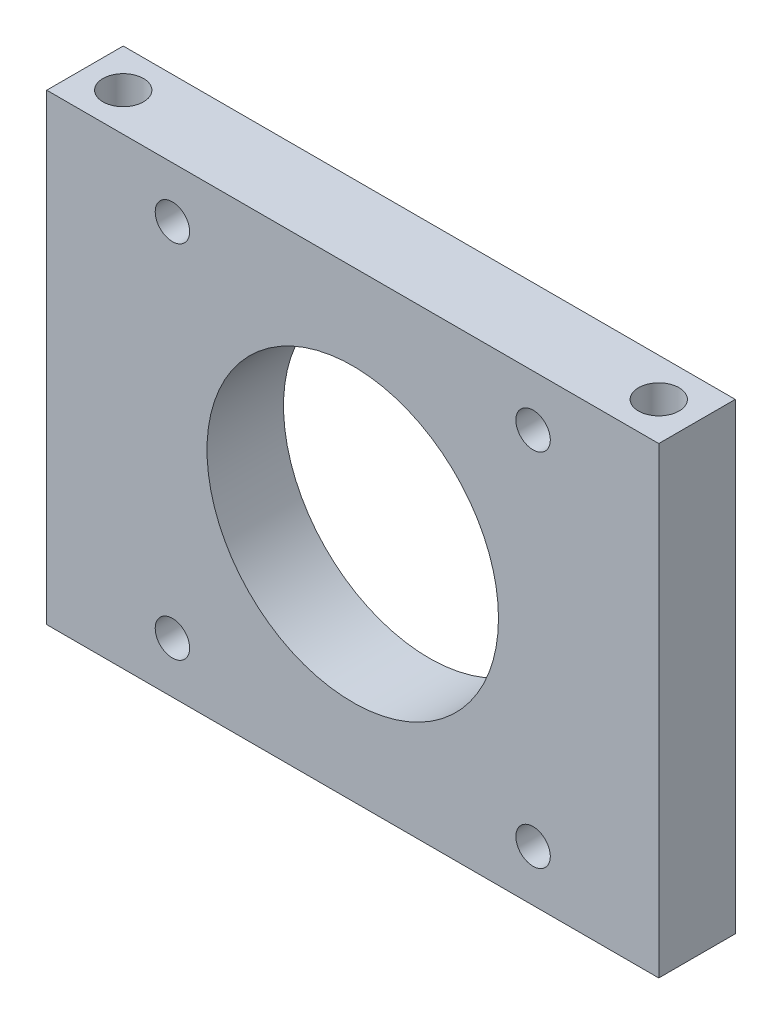
ISO-10303-21;
HEADER;
FILE_DESCRIPTION(('STEP AP214'),'2;1');
FILE_NAME('part.step','',(''),(''),'','','');
FILE_SCHEMA(('AUTOMOTIVE_DESIGN { 1 0 10303 214 1 1 1 1 }'));
ENDSEC;
DATA;
#1=APPLICATION_CONTEXT('core data for automotive mechanical design processes');
#2=APPLICATION_PROTOCOL_DEFINITION('international standard','automotive_design',2000,#1);
#3=PRODUCT_CONTEXT('',#1,'mechanical');
#4=PRODUCT('Part','Part','',(#3));
#5=PRODUCT_RELATED_PRODUCT_CATEGORY('part','',(#4));
#6=PRODUCT_DEFINITION_FORMATION('','',#4);
#7=PRODUCT_DEFINITION_CONTEXT('part definition',#1,'design');
#8=PRODUCT_DEFINITION('design','',#6,#7);
#9=PRODUCT_DEFINITION_SHAPE('','',#8);
#10=(LENGTH_UNIT() NAMED_UNIT(*) SI_UNIT(.MILLI.,.METRE.));
#11=(NAMED_UNIT(*) PLANE_ANGLE_UNIT() SI_UNIT($,.RADIAN.));
#12=(NAMED_UNIT(*) SI_UNIT($,.STERADIAN.) SOLID_ANGLE_UNIT());
#13=UNCERTAINTY_MEASURE_WITH_UNIT(LENGTH_MEASURE(1.E-05),#10,'distance_accuracy_value','');
#14=(GEOMETRIC_REPRESENTATION_CONTEXT(3) GLOBAL_UNCERTAINTY_ASSIGNED_CONTEXT((#13)) GLOBAL_UNIT_ASSIGNED_CONTEXT((#10,
#11,#12)) REPRESENTATION_CONTEXT('',''));
#15=CARTESIAN_POINT('',(0.,0.,0.));
#16=DIRECTION('',(0.,0.,1.));
#17=DIRECTION('',(1.,0.,0.));
#18=AXIS2_PLACEMENT_3D('',#15,#16,#17);
#19=CARTESIAN_POINT('',(40.,-30.25,5.));
#20=DIRECTION('',(-1.,0.,0.));
#21=DIRECTION('',(0.,0.,1.));
#22=AXIS2_PLACEMENT_3D('',#19,#20,#21);
#23=PLANE('',#22);
#24=DIRECTION('',(0.,1.,0.));
#25=VECTOR('',#24,1.);
#26=CARTESIAN_POINT('',(40.,-30.25,-5.));
#27=LINE('',#26,#25);
#28=CARTESIAN_POINT('',(40.,-30.25,-5.));
#29=VERTEX_POINT('',#28);
#30=CARTESIAN_POINT('',(40.,30.25,-5.));
#31=VERTEX_POINT('',#30);
#32=EDGE_CURVE('E96',#29,#31,#27,.T.);
#33=ORIENTED_EDGE('',*,*,#32,.T.);
#34=DIRECTION('',(0.,0.,-1.));
#35=VECTOR('',#34,1.);
#36=CARTESIAN_POINT('',(40.,30.25,5.));
#37=LINE('',#36,#35);
#38=CARTESIAN_POINT('',(40.,30.25,5.));
#39=VERTEX_POINT('',#38);
#40=EDGE_CURVE('E11',#39,#31,#37,.T.);
#41=ORIENTED_EDGE('',*,*,#40,.F.);
#42=DIRECTION('',(0.,1.,0.));
#43=VECTOR('',#42,1.);
#44=CARTESIAN_POINT('',(40.,-30.25,5.));
#45=LINE('',#44,#43);
#46=CARTESIAN_POINT('',(40.,-30.25,5.));
#47=VERTEX_POINT('',#46);
#48=EDGE_CURVE('E84',#47,#39,#45,.T.);
#49=ORIENTED_EDGE('',*,*,#48,.F.);
#50=DIRECTION('',(0.,0.,-1.));
#51=VECTOR('',#50,1.);
#52=CARTESIAN_POINT('',(40.,-30.25,5.));
#53=LINE('',#52,#51);
#54=EDGE_CURVE('E92',#47,#29,#53,.T.);
#55=ORIENTED_EDGE('',*,*,#54,.T.);
#56=EDGE_LOOP('',(#33,#41,#49,#55));
#57=FACE_BOUND('',#56,.T.);
#58=ADVANCED_FACE('F33',(#57),#23,.F.);
#59=CARTESIAN_POINT('',(-40.,30.25,5.));
#60=DIRECTION('',(0.,-1.,0.));
#61=DIRECTION('',(0.,0.,-1.));
#62=AXIS2_PLACEMENT_3D('',#59,#60,#61);
#63=PLANE('',#62);
#64=CARTESIAN_POINT('',(-35.,30.25,0.));
#65=DIRECTION('',(0.,1.,0.));
#66=DIRECTION('',(0.,0.,1.));
#67=AXIS2_PLACEMENT_3D('',#64,#65,#66);
#68=CIRCLE('',#67,2.65);
#69=CARTESIAN_POINT('',(-35.,30.25,2.65));
#70=VERTEX_POINT('',#69);
#71=EDGE_CURVE('E148',#70,#70,#68,.T.);
#72=ORIENTED_EDGE('',*,*,#71,.F.);
#73=EDGE_LOOP('',(#72));
#74=FACE_BOUND('',#73,.T.);
#75=CARTESIAN_POINT('',(35.,30.25,0.));
#76=DIRECTION('',(0.,1.,0.));
#77=DIRECTION('',(0.,0.,1.));
#78=AXIS2_PLACEMENT_3D('',#75,#76,#77);
#79=CIRCLE('',#78,2.65);
#80=CARTESIAN_POINT('',(35.,30.25,2.65));
#81=VERTEX_POINT('',#80);
#82=EDGE_CURVE('E142',#81,#81,#79,.T.);
#83=ORIENTED_EDGE('',*,*,#82,.F.);
#84=EDGE_LOOP('',(#83));
#85=FACE_BOUND('',#84,.T.);
#86=DIRECTION('',(-1.,0.,0.));
#87=VECTOR('',#86,1.);
#88=CARTESIAN_POINT('',(-40.,30.25,-5.));
#89=LINE('',#88,#87);
#90=CARTESIAN_POINT('',(-40.,30.25,-5.));
#91=VERTEX_POINT('',#90);
#92=EDGE_CURVE('E88',#31,#91,#89,.T.);
#93=ORIENTED_EDGE('',*,*,#92,.T.);
#94=DIRECTION('',(0.,0.,-1.));
#95=VECTOR('',#94,1.);
#96=CARTESIAN_POINT('',(-40.,30.25,5.));
#97=LINE('',#96,#95);
#98=CARTESIAN_POINT('',(-40.,30.25,5.));
#99=VERTEX_POINT('',#98);
#100=EDGE_CURVE('E41',#99,#91,#97,.T.);
#101=ORIENTED_EDGE('',*,*,#100,.F.);
#102=DIRECTION('',(-1.,0.,0.));
#103=VECTOR('',#102,1.);
#104=CARTESIAN_POINT('',(-40.,30.25,5.));
#105=LINE('',#104,#103);
#106=EDGE_CURVE('E79',#39,#99,#105,.T.);
#107=ORIENTED_EDGE('',*,*,#106,.F.);
#108=ORIENTED_EDGE('',*,*,#40,.T.);
#109=EDGE_LOOP('',(#93,#101,#107,#108));
#110=FACE_BOUND('',#109,.T.);
#111=ADVANCED_FACE('F87',(#74,#85,#110),#63,.F.);
#112=CARTESIAN_POINT('',(-40.,-30.25,5.));
#113=DIRECTION('',(1.,0.,0.));
#114=DIRECTION('',(0.,0.,-1.));
#115=AXIS2_PLACEMENT_3D('',#112,#113,#114);
#116=PLANE('',#115);
#117=DIRECTION('',(0.,-1.,0.));
#118=VECTOR('',#117,1.);
#119=CARTESIAN_POINT('',(-40.,-30.25,-5.));
#120=LINE('',#119,#118);
#121=CARTESIAN_POINT('',(-40.,-30.25,-5.));
#122=VERTEX_POINT('',#121);
#123=EDGE_CURVE('E66',#91,#122,#120,.T.);
#124=ORIENTED_EDGE('',*,*,#123,.T.);
#125=DIRECTION('',(0.,0.,-1.));
#126=VECTOR('',#125,1.);
#127=CARTESIAN_POINT('',(-40.,-30.25,5.));
#128=LINE('',#127,#126);
#129=CARTESIAN_POINT('',(-40.,-30.25,5.));
#130=VERTEX_POINT('',#129);
#131=EDGE_CURVE('E89',#130,#122,#128,.T.);
#132=ORIENTED_EDGE('',*,*,#131,.F.);
#133=DIRECTION('',(0.,-1.,0.));
#134=VECTOR('',#133,1.);
#135=CARTESIAN_POINT('',(-40.,-30.25,5.));
#136=LINE('',#135,#134);
#137=EDGE_CURVE('E82',#99,#130,#136,.T.);
#138=ORIENTED_EDGE('',*,*,#137,.F.);
#139=ORIENTED_EDGE('',*,*,#100,.T.);
#140=EDGE_LOOP('',(#124,#132,#138,#139));
#141=FACE_BOUND('',#140,.T.);
#142=ADVANCED_FACE('F90',(#141),#116,.F.);
#143=CARTESIAN_POINT('',(-40.,-30.25,5.));
#144=DIRECTION('',(0.,1.,0.));
#145=DIRECTION('',(0.,0.,1.));
#146=AXIS2_PLACEMENT_3D('',#143,#144,#145);
#147=PLANE('',#146);
#148=CARTESIAN_POINT('',(-35.,-30.25,0.));
#149=DIRECTION('',(0.,1.,0.));
#150=DIRECTION('',(0.,0.,1.));
#151=AXIS2_PLACEMENT_3D('',#148,#149,#150);
#152=CIRCLE('',#151,2.64999999999999);
#153=CARTESIAN_POINT('',(-35.,-30.25,2.64999999999999));
#154=VERTEX_POINT('',#153);
#155=EDGE_CURVE('E145',#154,#154,#152,.T.);
#156=ORIENTED_EDGE('',*,*,#155,.T.);
#157=EDGE_LOOP('',(#156));
#158=FACE_BOUND('',#157,.T.);
#159=CARTESIAN_POINT('',(35.,-30.25,0.));
#160=DIRECTION('',(0.,1.,0.));
#161=DIRECTION('',(0.,0.,1.));
#162=AXIS2_PLACEMENT_3D('',#159,#160,#161);
#163=CIRCLE('',#162,2.64999999999999);
#164=CARTESIAN_POINT('',(35.,-30.25,2.64999999999999));
#165=VERTEX_POINT('',#164);
#166=EDGE_CURVE('E139',#165,#165,#163,.T.);
#167=ORIENTED_EDGE('',*,*,#166,.T.);
#168=EDGE_LOOP('',(#167));
#169=FACE_BOUND('',#168,.T.);
#170=DIRECTION('',(1.,0.,0.));
#171=VECTOR('',#170,1.);
#172=CARTESIAN_POINT('',(-40.,-30.25,-5.));
#173=LINE('',#172,#171);
#174=EDGE_CURVE('E72',#122,#29,#173,.T.);
#175=ORIENTED_EDGE('',*,*,#174,.T.);
#176=ORIENTED_EDGE('',*,*,#54,.F.);
#177=DIRECTION('',(1.,0.,0.));
#178=VECTOR('',#177,1.);
#179=CARTESIAN_POINT('',(-40.,-30.25,5.));
#180=LINE('',#179,#178);
#181=EDGE_CURVE('E49',#130,#47,#180,.T.);
#182=ORIENTED_EDGE('',*,*,#181,.F.);
#183=ORIENTED_EDGE('',*,*,#131,.T.);
#184=EDGE_LOOP('',(#175,#176,#182,#183));
#185=FACE_BOUND('',#184,.T.);
#186=ADVANCED_FACE('F104',(#158,#169,#185),#147,.F.);
#187=CARTESIAN_POINT('',(0.,0.,5.));
#188=DIRECTION('',(0.,0.,-1.));
#189=DIRECTION('',(-1.,0.,0.));
#190=AXIS2_PLACEMENT_3D('',#187,#188,#189);
#191=PLANE('',#190);
#192=CARTESIAN_POINT('',(-23.57,23.57,5.));
#193=DIRECTION('',(0.,0.,-1.));
#194=DIRECTION('',(-1.,0.,0.));
#195=AXIS2_PLACEMENT_3D('',#192,#193,#194);
#196=CIRCLE('',#195,2.25);
#197=CARTESIAN_POINT('',(-25.82,23.57,5.));
#198=VERTEX_POINT('',#197);
#199=EDGE_CURVE('E133',#198,#198,#196,.T.);
#200=ORIENTED_EDGE('',*,*,#199,.T.);
#201=EDGE_LOOP('',(#200));
#202=FACE_BOUND('',#201,.T.);
#203=CARTESIAN_POINT('',(23.57,-23.57,5.));
#204=DIRECTION('',(0.,0.,-1.));
#205=DIRECTION('',(-1.,0.,0.));
#206=AXIS2_PLACEMENT_3D('',#203,#204,#205);
#207=CIRCLE('',#206,2.25);
#208=CARTESIAN_POINT('',(21.32,-23.57,5.));
#209=VERTEX_POINT('',#208);
#210=EDGE_CURVE('E127',#209,#209,#207,.T.);
#211=ORIENTED_EDGE('',*,*,#210,.T.);
#212=EDGE_LOOP('',(#211));
#213=FACE_BOUND('',#212,.T.);
#214=CARTESIAN_POINT('',(23.57,23.57,5.));
#215=DIRECTION('',(0.,0.,-1.));
#216=DIRECTION('',(-1.,0.,0.));
#217=AXIS2_PLACEMENT_3D('',#214,#215,#216);
#218=CIRCLE('',#217,2.25);
#219=CARTESIAN_POINT('',(21.32,23.57,5.));
#220=VERTEX_POINT('',#219);
#221=EDGE_CURVE('E121',#220,#220,#218,.T.);
#222=ORIENTED_EDGE('',*,*,#221,.T.);
#223=EDGE_LOOP('',(#222));
#224=FACE_BOUND('',#223,.T.);
#225=CARTESIAN_POINT('',(-23.57,-23.57,5.));
#226=DIRECTION('',(0.,0.,-1.));
#227=DIRECTION('',(-1.,0.,0.));
#228=AXIS2_PLACEMENT_3D('',#225,#226,#227);
#229=CIRCLE('',#228,2.25);
#230=CARTESIAN_POINT('',(-25.82,-23.57,5.));
#231=VERTEX_POINT('',#230);
#232=EDGE_CURVE('E113',#231,#231,#229,.T.);
#233=ORIENTED_EDGE('',*,*,#232,.T.);
#234=EDGE_LOOP('',(#233));
#235=FACE_BOUND('',#234,.T.);
#236=CARTESIAN_POINT('',(0.,0.,5.));
#237=DIRECTION('',(0.,0.,1.));
#238=DIRECTION('',(1.,0.,0.));
#239=AXIS2_PLACEMENT_3D('',#236,#237,#238);
#240=CIRCLE('',#239,19.05);
#241=CARTESIAN_POINT('',(19.05,0.,5.));
#242=VERTEX_POINT('',#241);
#243=EDGE_CURVE('E110',#242,#242,#240,.T.);
#244=ORIENTED_EDGE('',*,*,#243,.F.);
#245=EDGE_LOOP('',(#244));
#246=FACE_BOUND('',#245,.T.);
#247=ORIENTED_EDGE('',*,*,#48,.T.);
#248=ORIENTED_EDGE('',*,*,#106,.T.);
#249=ORIENTED_EDGE('',*,*,#137,.T.);
#250=ORIENTED_EDGE('',*,*,#181,.T.);
#251=EDGE_LOOP('',(#247,#248,#249,#250));
#252=FACE_BOUND('',#251,.T.);
#253=ADVANCED_FACE('F80',(#202,#213,#224,#235,#246,#252),#191,.F.);
#254=CARTESIAN_POINT('',(0.,0.,-5.));
#255=DIRECTION('',(0.,0.,-1.));
#256=DIRECTION('',(-1.,0.,0.));
#257=AXIS2_PLACEMENT_3D('',#254,#255,#256);
#258=PLANE('',#257);
#259=CARTESIAN_POINT('',(-23.57,23.57,-5.));
#260=DIRECTION('',(0.,0.,-1.));
#261=DIRECTION('',(-1.,0.,0.));
#262=AXIS2_PLACEMENT_3D('',#259,#260,#261);
#263=CIRCLE('',#262,2.25);
#264=CARTESIAN_POINT('',(-25.82,23.57,-5.));
#265=VERTEX_POINT('',#264);
#266=EDGE_CURVE('E136',#265,#265,#263,.T.);
#267=ORIENTED_EDGE('',*,*,#266,.F.);
#268=EDGE_LOOP('',(#267));
#269=FACE_BOUND('',#268,.T.);
#270=CARTESIAN_POINT('',(23.57,-23.57,-5.));
#271=DIRECTION('',(0.,0.,-1.));
#272=DIRECTION('',(-1.,0.,0.));
#273=AXIS2_PLACEMENT_3D('',#270,#271,#272);
#274=CIRCLE('',#273,2.25);
#275=CARTESIAN_POINT('',(21.32,-23.57,-5.));
#276=VERTEX_POINT('',#275);
#277=EDGE_CURVE('E130',#276,#276,#274,.T.);
#278=ORIENTED_EDGE('',*,*,#277,.F.);
#279=EDGE_LOOP('',(#278));
#280=FACE_BOUND('',#279,.T.);
#281=CARTESIAN_POINT('',(23.57,23.57,-5.));
#282=DIRECTION('',(0.,0.,-1.));
#283=DIRECTION('',(-1.,0.,0.));
#284=AXIS2_PLACEMENT_3D('',#281,#282,#283);
#285=CIRCLE('',#284,2.25);
#286=CARTESIAN_POINT('',(21.32,23.57,-5.));
#287=VERTEX_POINT('',#286);
#288=EDGE_CURVE('E124',#287,#287,#285,.T.);
#289=ORIENTED_EDGE('',*,*,#288,.F.);
#290=EDGE_LOOP('',(#289));
#291=FACE_BOUND('',#290,.T.);
#292=CARTESIAN_POINT('',(-23.57,-23.57,-5.));
#293=DIRECTION('',(0.,0.,-1.));
#294=DIRECTION('',(-1.,0.,0.));
#295=AXIS2_PLACEMENT_3D('',#292,#293,#294);
#296=CIRCLE('',#295,2.25);
#297=CARTESIAN_POINT('',(-25.82,-23.57,-5.));
#298=VERTEX_POINT('',#297);
#299=EDGE_CURVE('E118',#298,#298,#296,.T.);
#300=ORIENTED_EDGE('',*,*,#299,.F.);
#301=EDGE_LOOP('',(#300));
#302=FACE_BOUND('',#301,.T.);
#303=CARTESIAN_POINT('',(0.,0.,-5.));
#304=DIRECTION('',(0.,0.,1.));
#305=DIRECTION('',(1.,0.,0.));
#306=AXIS2_PLACEMENT_3D('',#303,#304,#305);
#307=CIRCLE('',#306,19.05);
#308=CARTESIAN_POINT('',(19.05,0.,-5.));
#309=VERTEX_POINT('',#308);
#310=EDGE_CURVE('E99',#309,#309,#307,.T.);
#311=ORIENTED_EDGE('',*,*,#310,.T.);
#312=EDGE_LOOP('',(#311));
#313=FACE_BOUND('',#312,.T.);
#314=ORIENTED_EDGE('',*,*,#32,.F.);
#315=ORIENTED_EDGE('',*,*,#174,.F.);
#316=ORIENTED_EDGE('',*,*,#123,.F.);
#317=ORIENTED_EDGE('',*,*,#92,.F.);
#318=EDGE_LOOP('',(#314,#315,#316,#317));
#319=FACE_BOUND('',#318,.T.);
#320=ADVANCED_FACE('F107',(#269,#280,#291,#302,#313,#319),#258,.T.);
#321=CARTESIAN_POINT('',(0.,0.,-5.));
#322=DIRECTION('',(0.,0.,1.));
#323=DIRECTION('',(1.,0.,0.));
#324=AXIS2_PLACEMENT_3D('',#321,#322,#323);
#325=CYLINDRICAL_SURFACE('',#324,19.05);
#326=ORIENTED_EDGE('',*,*,#310,.F.);
#327=EDGE_LOOP('',(#326));
#328=FACE_BOUND('',#327,.T.);
#329=ORIENTED_EDGE('',*,*,#243,.T.);
#330=EDGE_LOOP('',(#329));
#331=FACE_BOUND('',#330,.T.);
#332=ADVANCED_FACE('F208',(#328,#331),#325,.F.);
#333=CARTESIAN_POINT('',(-23.57,-23.57,-5.));
#334=DIRECTION('',(0.,0.,-1.));
#335=DIRECTION('',(-1.,0.,0.));
#336=AXIS2_PLACEMENT_3D('',#333,#334,#335);
#337=CYLINDRICAL_SURFACE('',#336,2.25);
#338=ORIENTED_EDGE('',*,*,#232,.F.);
#339=EDGE_LOOP('',(#338));
#340=FACE_BOUND('',#339,.T.);
#341=ORIENTED_EDGE('',*,*,#299,.T.);
#342=EDGE_LOOP('',(#341));
#343=FACE_BOUND('',#342,.T.);
#344=ADVANCED_FACE('F216',(#340,#343),#337,.F.);
#345=CARTESIAN_POINT('',(23.57,23.57,-5.));
#346=DIRECTION('',(0.,0.,-1.));
#347=DIRECTION('',(-1.,0.,0.));
#348=AXIS2_PLACEMENT_3D('',#345,#346,#347);
#349=CYLINDRICAL_SURFACE('',#348,2.25);
#350=ORIENTED_EDGE('',*,*,#221,.F.);
#351=EDGE_LOOP('',(#350));
#352=FACE_BOUND('',#351,.T.);
#353=ORIENTED_EDGE('',*,*,#288,.T.);
#354=EDGE_LOOP('',(#353));
#355=FACE_BOUND('',#354,.T.);
#356=ADVANCED_FACE('F223',(#352,#355),#349,.F.);
#357=CARTESIAN_POINT('',(23.57,-23.57,-5.));
#358=DIRECTION('',(0.,0.,-1.));
#359=DIRECTION('',(-1.,0.,0.));
#360=AXIS2_PLACEMENT_3D('',#357,#358,#359);
#361=CYLINDRICAL_SURFACE('',#360,2.25);
#362=ORIENTED_EDGE('',*,*,#210,.F.);
#363=EDGE_LOOP('',(#362));
#364=FACE_BOUND('',#363,.T.);
#365=ORIENTED_EDGE('',*,*,#277,.T.);
#366=EDGE_LOOP('',(#365));
#367=FACE_BOUND('',#366,.T.);
#368=ADVANCED_FACE('F169',(#364,#367),#361,.F.);
#369=CARTESIAN_POINT('',(-23.57,23.57,-5.));
#370=DIRECTION('',(0.,0.,-1.));
#371=DIRECTION('',(-1.,0.,0.));
#372=AXIS2_PLACEMENT_3D('',#369,#370,#371);
#373=CYLINDRICAL_SURFACE('',#372,2.25);
#374=ORIENTED_EDGE('',*,*,#199,.F.);
#375=EDGE_LOOP('',(#374));
#376=FACE_BOUND('',#375,.T.);
#377=ORIENTED_EDGE('',*,*,#266,.T.);
#378=EDGE_LOOP('',(#377));
#379=FACE_BOUND('',#378,.T.);
#380=ADVANCED_FACE('F160',(#376,#379),#373,.F.);
#381=CARTESIAN_POINT('',(35.,30.25,0.));
#382=DIRECTION('',(0.,1.,0.));
#383=DIRECTION('',(0.,0.,1.));
#384=AXIS2_PLACEMENT_3D('',#381,#382,#383);
#385=CYLINDRICAL_SURFACE('',#384,2.64999999999999);
#386=ORIENTED_EDGE('',*,*,#166,.F.);
#387=EDGE_LOOP('',(#386));
#388=FACE_BOUND('',#387,.T.);
#389=ORIENTED_EDGE('',*,*,#82,.T.);
#390=EDGE_LOOP('',(#389));
#391=FACE_BOUND('',#390,.T.);
#392=ADVANCED_FACE('F158',(#388,#391),#385,.F.);
#393=CARTESIAN_POINT('',(-35.,30.25,0.));
#394=DIRECTION('',(0.,1.,0.));
#395=DIRECTION('',(0.,0.,1.));
#396=AXIS2_PLACEMENT_3D('',#393,#394,#395);
#397=CYLINDRICAL_SURFACE('',#396,2.64999999999999);
#398=ORIENTED_EDGE('',*,*,#155,.F.);
#399=EDGE_LOOP('',(#398));
#400=FACE_BOUND('',#399,.T.);
#401=ORIENTED_EDGE('',*,*,#71,.T.);
#402=EDGE_LOOP('',(#401));
#403=FACE_BOUND('',#402,.T.);
#404=ADVANCED_FACE('F152',(#400,#403),#397,.F.);
#405=CLOSED_SHELL('',(#58,#111,#142,#186,#253,#320,#332,#344,#356,#368,#380,#392,#404));
#406=MANIFOLD_SOLID_BREP('B2',#405);
#407=ADVANCED_BREP_SHAPE_REPRESENTATION('',(#18,#406),#14);
#408=SHAPE_DEFINITION_REPRESENTATION(#9,#407);
ENDSEC;
END-ISO-10303-21;
